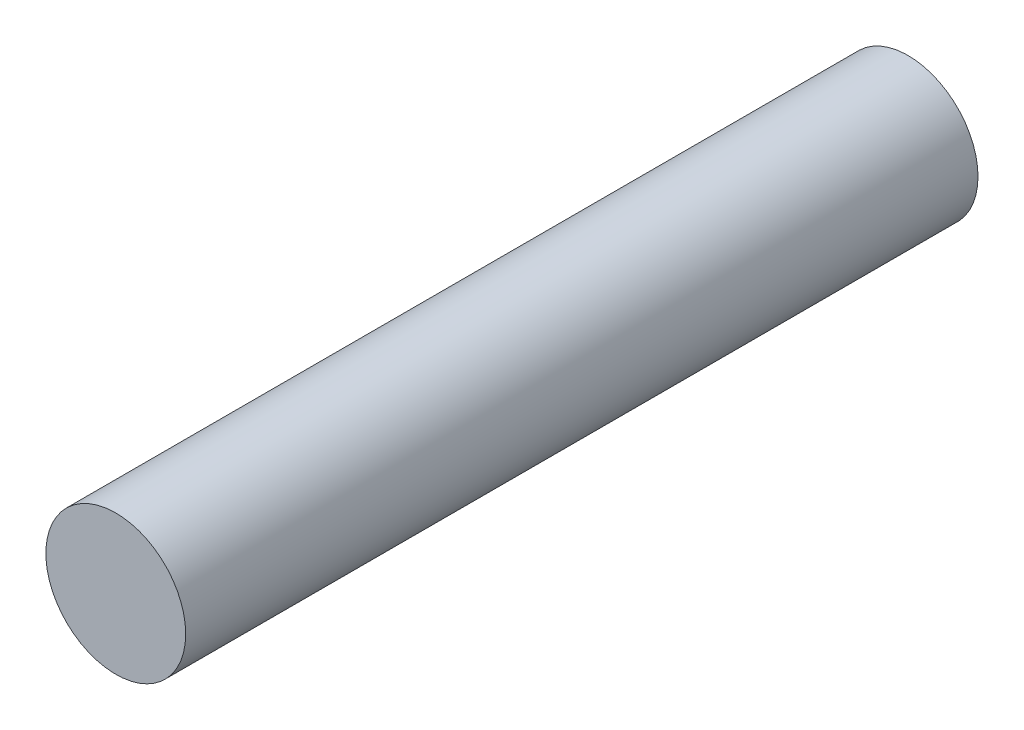
ISO-10303-21;
HEADER;
FILE_DESCRIPTION(('STEP AP214'),'2;1');
FILE_NAME('part.step','',(''),(''),'','','');
FILE_SCHEMA(('AUTOMOTIVE_DESIGN { 1 0 10303 214 1 1 1 1 }'));
ENDSEC;
DATA;
#1=APPLICATION_CONTEXT('core data for automotive mechanical design processes');
#2=APPLICATION_PROTOCOL_DEFINITION('international standard','automotive_design',2000,#1);
#3=PRODUCT_CONTEXT('',#1,'mechanical');
#4=PRODUCT('Part','Part','',(#3));
#5=PRODUCT_RELATED_PRODUCT_CATEGORY('part','',(#4));
#6=PRODUCT_DEFINITION_FORMATION('','',#4);
#7=PRODUCT_DEFINITION_CONTEXT('part definition',#1,'design');
#8=PRODUCT_DEFINITION('design','',#6,#7);
#9=PRODUCT_DEFINITION_SHAPE('','',#8);
#10=(LENGTH_UNIT() NAMED_UNIT(*) SI_UNIT(.MILLI.,.METRE.));
#11=(NAMED_UNIT(*) PLANE_ANGLE_UNIT() SI_UNIT($,.RADIAN.));
#12=(NAMED_UNIT(*) SI_UNIT($,.STERADIAN.) SOLID_ANGLE_UNIT());
#13=UNCERTAINTY_MEASURE_WITH_UNIT(LENGTH_MEASURE(1.E-05),#10,'distance_accuracy_value','');
#14=(GEOMETRIC_REPRESENTATION_CONTEXT(3) GLOBAL_UNCERTAINTY_ASSIGNED_CONTEXT((#13)) GLOBAL_UNIT_ASSIGNED_CONTEXT((#10,
#11,#12)) REPRESENTATION_CONTEXT('',''));
#15=CARTESIAN_POINT('',(0.,0.,0.));
#16=DIRECTION('',(0.,0.,1.));
#17=DIRECTION('',(1.,0.,0.));
#18=AXIS2_PLACEMENT_3D('',#15,#16,#17);
#19=CARTESIAN_POINT('',(0.,0.,34.000000056));
#20=DIRECTION('',(0.,0.,-1.));
#21=DIRECTION('',(-1.,0.,0.));
#22=AXIS2_PLACEMENT_3D('',#19,#20,#21);
#23=CYLINDRICAL_SURFACE('',#22,3.);
#24=CARTESIAN_POINT('',(0.,0.,34.000000056));
#25=DIRECTION('',(0.,0.,1.));
#26=DIRECTION('',(1.,0.,0.));
#27=AXIS2_PLACEMENT_3D('',#24,#25,#26);
#28=CIRCLE('',#27,3.);
#29=CARTESIAN_POINT('',(3.,0.,34.000000056));
#30=VERTEX_POINT('',#29);
#31=EDGE_CURVE('E10',#30,#30,#28,.T.);
#32=ORIENTED_EDGE('',*,*,#31,.F.);
#33=EDGE_LOOP('',(#32));
#34=FACE_BOUND('',#33,.T.);
#35=CARTESIAN_POINT('',(0.,0.,0.));
#36=DIRECTION('',(0.,0.,1.));
#37=DIRECTION('',(1.,0.,0.));
#38=AXIS2_PLACEMENT_3D('',#35,#36,#37);
#39=CIRCLE('',#38,3.);
#40=CARTESIAN_POINT('',(3.,0.,0.));
#41=VERTEX_POINT('',#40);
#42=EDGE_CURVE('E40',#41,#41,#39,.T.);
#43=ORIENTED_EDGE('',*,*,#42,.T.);
#44=EDGE_LOOP('',(#43));
#45=FACE_BOUND('',#44,.T.);
#46=ADVANCED_FACE('F37',(#34,#45),#23,.T.);
#47=CARTESIAN_POINT('',(0.,0.,34.000000056));
#48=DIRECTION('',(0.,0.,1.));
#49=DIRECTION('',(1.,0.,0.));
#50=AXIS2_PLACEMENT_3D('',#47,#48,#49);
#51=PLANE('',#50);
#52=ORIENTED_EDGE('',*,*,#31,.T.);
#53=EDGE_LOOP('',(#52));
#54=FACE_BOUND('',#53,.T.);
#55=ADVANCED_FACE('F54',(#54),#51,.T.);
#56=CARTESIAN_POINT('',(0.,0.,0.));
#57=DIRECTION('',(0.,0.,1.));
#58=DIRECTION('',(1.,0.,0.));
#59=AXIS2_PLACEMENT_3D('',#56,#57,#58);
#60=PLANE('',#59);
#61=ORIENTED_EDGE('',*,*,#42,.F.);
#62=EDGE_LOOP('',(#61));
#63=FACE_BOUND('',#62,.T.);
#64=ADVANCED_FACE('F52',(#63),#60,.F.);
#65=CLOSED_SHELL('',(#46,#55,#64));
#66=MANIFOLD_SOLID_BREP('B2',#65);
#67=ADVANCED_BREP_SHAPE_REPRESENTATION('',(#18,#66),#14);
#68=SHAPE_DEFINITION_REPRESENTATION(#9,#67);
ENDSEC;
END-ISO-10303-21;
